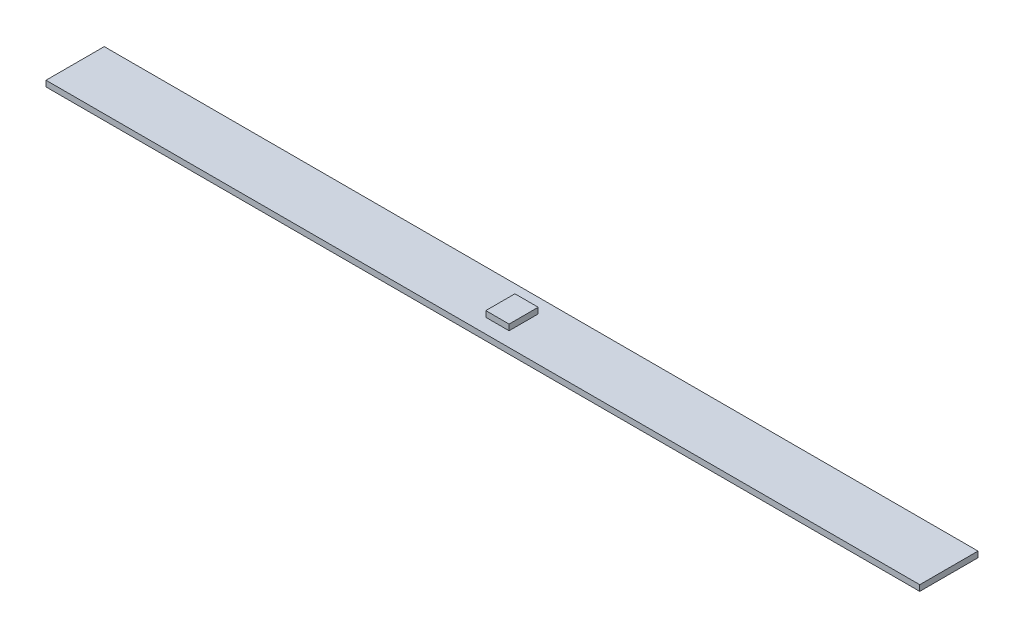
ISO-10303-21;
HEADER;
FILE_DESCRIPTION(('STEP AP214'),'2;1');
FILE_NAME('part.step','',(''),(''),'','','');
FILE_SCHEMA(('AUTOMOTIVE_DESIGN { 1 0 10303 214 1 1 1 1 }'));
ENDSEC;
DATA;
#1=APPLICATION_CONTEXT('core data for automotive mechanical design processes');
#2=APPLICATION_PROTOCOL_DEFINITION('international standard','automotive_design',2000,#1);
#3=PRODUCT_CONTEXT('',#1,'mechanical');
#4=PRODUCT('Part','Part','',(#3));
#5=PRODUCT_RELATED_PRODUCT_CATEGORY('part','',(#4));
#6=PRODUCT_DEFINITION_FORMATION('','',#4);
#7=PRODUCT_DEFINITION_CONTEXT('part definition',#1,'design');
#8=PRODUCT_DEFINITION('design','',#6,#7);
#9=PRODUCT_DEFINITION_SHAPE('','',#8);
#10=(LENGTH_UNIT() NAMED_UNIT(*) SI_UNIT(.MILLI.,.METRE.));
#11=(NAMED_UNIT(*) PLANE_ANGLE_UNIT() SI_UNIT($,.RADIAN.));
#12=(NAMED_UNIT(*) SI_UNIT($,.STERADIAN.) SOLID_ANGLE_UNIT());
#13=UNCERTAINTY_MEASURE_WITH_UNIT(LENGTH_MEASURE(1.E-05),#10,'distance_accuracy_value','');
#14=(GEOMETRIC_REPRESENTATION_CONTEXT(3) GLOBAL_UNCERTAINTY_ASSIGNED_CONTEXT((#13)) GLOBAL_UNIT_ASSIGNED_CONTEXT((#10,
#11,#12)) REPRESENTATION_CONTEXT('',''));
#15=CARTESIAN_POINT('',(0.,0.,0.));
#16=DIRECTION('',(0.,0.,1.));
#17=DIRECTION('',(1.,0.,0.));
#18=AXIS2_PLACEMENT_3D('',#15,#16,#17);
#19=CARTESIAN_POINT('',(0.,1.,0.));
#20=DIRECTION('',(0.,1.,0.));
#21=DIRECTION('',(0.,0.,1.));
#22=AXIS2_PLACEMENT_3D('',#19,#20,#21);
#23=PLANE('',#22);
#24=DIRECTION('',(0.,0.,-1.));
#25=VECTOR('',#24,1.);
#26=CARTESIAN_POINT('',(75.,1.,-5.));
#27=LINE('',#26,#25);
#28=CARTESIAN_POINT('',(75.,1.,5.));
#29=VERTEX_POINT('',#28);
#30=CARTESIAN_POINT('',(75.,1.,-5.));
#31=VERTEX_POINT('',#30);
#32=EDGE_CURVE('E154',#29,#31,#27,.T.);
#33=ORIENTED_EDGE('',*,*,#32,.T.);
#34=DIRECTION('',(-1.,0.,0.));
#35=VECTOR('',#34,1.);
#36=CARTESIAN_POINT('',(-75.,1.,-5.));
#37=LINE('',#36,#35);
#38=CARTESIAN_POINT('',(-75.,1.,-5.));
#39=VERTEX_POINT('',#38);
#40=EDGE_CURVE('E94',#31,#39,#37,.T.);
#41=ORIENTED_EDGE('',*,*,#40,.T.);
#42=DIRECTION('',(0.,0.,1.));
#43=VECTOR('',#42,1.);
#44=CARTESIAN_POINT('',(-75.,1.,-5.));
#45=LINE('',#44,#43);
#46=CARTESIAN_POINT('',(-75.,1.,5.));
#47=VERTEX_POINT('',#46);
#48=EDGE_CURVE('E159',#39,#47,#45,.T.);
#49=ORIENTED_EDGE('',*,*,#48,.T.);
#50=DIRECTION('',(1.,0.,0.));
#51=VECTOR('',#50,1.);
#52=CARTESIAN_POINT('',(-75.,1.,5.));
#53=LINE('',#52,#51);
#54=EDGE_CURVE('E66',#47,#29,#53,.T.);
#55=ORIENTED_EDGE('',*,*,#54,.T.);
#56=EDGE_LOOP('',(#33,#41,#49,#55));
#57=FACE_BOUND('',#56,.T.);
#58=DIRECTION('',(-1.,0.,0.));
#59=VECTOR('',#58,1.);
#60=CARTESIAN_POINT('',(-2.,1.,-2.5));
#61=LINE('',#60,#59);
#62=CARTESIAN_POINT('',(2.,1.,-2.5));
#63=VERTEX_POINT('',#62);
#64=CARTESIAN_POINT('',(-2.,1.,-2.5));
#65=VERTEX_POINT('',#64);
#66=EDGE_CURVE('E291',#63,#65,#61,.T.);
#67=ORIENTED_EDGE('',*,*,#66,.F.);
#68=DIRECTION('',(0.,0.,-1.));
#69=VECTOR('',#68,1.);
#70=CARTESIAN_POINT('',(2.,1.,-2.5));
#71=LINE('',#70,#69);
#72=CARTESIAN_POINT('',(2.,1.,2.5));
#73=VERTEX_POINT('',#72);
#74=EDGE_CURVE('E141',#73,#63,#71,.T.);
#75=ORIENTED_EDGE('',*,*,#74,.F.);
#76=DIRECTION('',(1.,0.,0.));
#77=VECTOR('',#76,1.);
#78=CARTESIAN_POINT('',(-2.,1.,2.5));
#79=LINE('',#78,#77);
#80=CARTESIAN_POINT('',(-2.,1.,2.5));
#81=VERTEX_POINT('',#80);
#82=EDGE_CURVE('E137',#81,#73,#79,.T.);
#83=ORIENTED_EDGE('',*,*,#82,.F.);
#84=DIRECTION('',(0.,0.,1.));
#85=VECTOR('',#84,1.);
#86=CARTESIAN_POINT('',(-2.,1.,-2.5));
#87=LINE('',#86,#85);
#88=EDGE_CURVE('E287',#65,#81,#87,.T.);
#89=ORIENTED_EDGE('',*,*,#88,.F.);
#90=EDGE_LOOP('',(#67,#75,#83,#89));
#91=FACE_BOUND('',#90,.T.);
#92=ADVANCED_FACE('F41',(#57,#91),#23,.T.);
#93=CARTESIAN_POINT('',(75.,1.,-5.));
#94=DIRECTION('',(-1.,0.,0.));
#95=DIRECTION('',(0.,0.,1.));
#96=AXIS2_PLACEMENT_3D('',#93,#94,#95);
#97=PLANE('',#96);
#98=DIRECTION('',(0.,0.,-1.));
#99=VECTOR('',#98,1.);
#100=CARTESIAN_POINT('',(75.,0.,-5.));
#101=LINE('',#100,#99);
#102=CARTESIAN_POINT('',(75.,0.,5.));
#103=VERTEX_POINT('',#102);
#104=CARTESIAN_POINT('',(75.,0.,-5.));
#105=VERTEX_POINT('',#104);
#106=EDGE_CURVE('E144',#103,#105,#101,.T.);
#107=ORIENTED_EDGE('',*,*,#106,.T.);
#108=DIRECTION('',(0.,-1.,0.));
#109=VECTOR('',#108,1.);
#110=CARTESIAN_POINT('',(75.,1.,-5.));
#111=LINE('',#110,#109);
#112=EDGE_CURVE('E11',#31,#105,#111,.T.);
#113=ORIENTED_EDGE('',*,*,#112,.F.);
#114=ORIENTED_EDGE('',*,*,#32,.F.);
#115=DIRECTION('',(0.,-1.,0.));
#116=VECTOR('',#115,1.);
#117=CARTESIAN_POINT('',(75.,1.,5.));
#118=LINE('',#117,#116);
#119=EDGE_CURVE('E163',#29,#103,#118,.T.);
#120=ORIENTED_EDGE('',*,*,#119,.T.);
#121=EDGE_LOOP('',(#107,#113,#114,#120));
#122=FACE_BOUND('',#121,.T.);
#123=ADVANCED_FACE('F43',(#122),#97,.F.);
#124=CARTESIAN_POINT('',(-75.,1.,-5.));
#125=DIRECTION('',(0.,0.,1.));
#126=DIRECTION('',(1.,0.,0.));
#127=AXIS2_PLACEMENT_3D('',#124,#125,#126);
#128=PLANE('',#127);
#129=DIRECTION('',(-1.,0.,0.));
#130=VECTOR('',#129,1.);
#131=CARTESIAN_POINT('',(-75.,0.,-5.));
#132=LINE('',#131,#130);
#133=CARTESIAN_POINT('',(-75.,0.,-5.));
#134=VERTEX_POINT('',#133);
#135=EDGE_CURVE('E149',#105,#134,#132,.T.);
#136=ORIENTED_EDGE('',*,*,#135,.T.);
#137=DIRECTION('',(0.,-1.,0.));
#138=VECTOR('',#137,1.);
#139=CARTESIAN_POINT('',(-75.,1.,-5.));
#140=LINE('',#139,#138);
#141=EDGE_CURVE('E50',#39,#134,#140,.T.);
#142=ORIENTED_EDGE('',*,*,#141,.F.);
#143=ORIENTED_EDGE('',*,*,#40,.F.);
#144=ORIENTED_EDGE('',*,*,#112,.T.);
#145=EDGE_LOOP('',(#136,#142,#143,#144));
#146=FACE_BOUND('',#145,.T.);
#147=ADVANCED_FACE('F197',(#146),#128,.F.);
#148=CARTESIAN_POINT('',(-75.,1.,-5.));
#149=DIRECTION('',(1.,0.,0.));
#150=DIRECTION('',(0.,0.,-1.));
#151=AXIS2_PLACEMENT_3D('',#148,#149,#150);
#152=PLANE('',#151);
#153=DIRECTION('',(0.,0.,1.));
#154=VECTOR('',#153,1.);
#155=CARTESIAN_POINT('',(-75.,0.,-5.));
#156=LINE('',#155,#154);
#157=CARTESIAN_POINT('',(-75.,0.,5.));
#158=VERTEX_POINT('',#157);
#159=EDGE_CURVE('E167',#134,#158,#156,.T.);
#160=ORIENTED_EDGE('',*,*,#159,.T.);
#161=DIRECTION('',(0.,-1.,0.));
#162=VECTOR('',#161,1.);
#163=CARTESIAN_POINT('',(-75.,1.,5.));
#164=LINE('',#163,#162);
#165=EDGE_CURVE('E174',#47,#158,#164,.T.);
#166=ORIENTED_EDGE('',*,*,#165,.F.);
#167=ORIENTED_EDGE('',*,*,#48,.F.);
#168=ORIENTED_EDGE('',*,*,#141,.T.);
#169=EDGE_LOOP('',(#160,#166,#167,#168));
#170=FACE_BOUND('',#169,.T.);
#171=ADVANCED_FACE('F181',(#170),#152,.F.);
#172=CARTESIAN_POINT('',(-75.,1.,5.));
#173=DIRECTION('',(0.,0.,-1.));
#174=DIRECTION('',(-1.,0.,0.));
#175=AXIS2_PLACEMENT_3D('',#172,#173,#174);
#176=PLANE('',#175);
#177=DIRECTION('',(1.,0.,0.));
#178=VECTOR('',#177,1.);
#179=CARTESIAN_POINT('',(-75.,0.,5.));
#180=LINE('',#179,#178);
#181=EDGE_CURVE('E87',#158,#103,#180,.T.);
#182=ORIENTED_EDGE('',*,*,#181,.T.);
#183=ORIENTED_EDGE('',*,*,#119,.F.);
#184=ORIENTED_EDGE('',*,*,#54,.F.);
#185=ORIENTED_EDGE('',*,*,#165,.T.);
#186=EDGE_LOOP('',(#182,#183,#184,#185));
#187=FACE_BOUND('',#186,.T.);
#188=ADVANCED_FACE('F189',(#187),#176,.F.);
#189=CARTESIAN_POINT('',(0.,0.,0.));
#190=DIRECTION('',(0.,1.,0.));
#191=DIRECTION('',(0.,0.,1.));
#192=AXIS2_PLACEMENT_3D('',#189,#190,#191);
#193=PLANE('',#192);
#194=ORIENTED_EDGE('',*,*,#106,.F.);
#195=ORIENTED_EDGE('',*,*,#181,.F.);
#196=ORIENTED_EDGE('',*,*,#159,.F.);
#197=ORIENTED_EDGE('',*,*,#135,.F.);
#198=EDGE_LOOP('',(#194,#195,#196,#197));
#199=FACE_BOUND('',#198,.T.);
#200=ADVANCED_FACE('F185',(#199),#193,.F.);
#201=CARTESIAN_POINT('',(2.,2.,-2.5));
#202=DIRECTION('',(-1.,0.,0.));
#203=DIRECTION('',(0.,0.,1.));
#204=AXIS2_PLACEMENT_3D('',#201,#202,#203);
#205=PLANE('',#204);
#206=ORIENTED_EDGE('',*,*,#74,.T.);
#207=DIRECTION('',(0.,-1.,0.));
#208=VECTOR('',#207,1.);
#209=CARTESIAN_POINT('',(2.,2.,-2.5));
#210=LINE('',#209,#208);
#211=CARTESIAN_POINT('',(2.,2.,-2.5));
#212=VERTEX_POINT('',#211);
#213=EDGE_CURVE('E120',#212,#63,#210,.T.);
#214=ORIENTED_EDGE('',*,*,#213,.F.);
#215=DIRECTION('',(0.,0.,-1.));
#216=VECTOR('',#215,1.);
#217=CARTESIAN_POINT('',(2.,2.,-2.5));
#218=LINE('',#217,#216);
#219=CARTESIAN_POINT('',(2.,2.,2.5));
#220=VERTEX_POINT('',#219);
#221=EDGE_CURVE('E128',#220,#212,#218,.T.);
#222=ORIENTED_EDGE('',*,*,#221,.F.);
#223=DIRECTION('',(0.,-1.,0.));
#224=VECTOR('',#223,1.);
#225=CARTESIAN_POINT('',(2.,2.,2.5));
#226=LINE('',#225,#224);
#227=EDGE_CURVE('E284',#220,#73,#226,.T.);
#228=ORIENTED_EDGE('',*,*,#227,.T.);
#229=EDGE_LOOP('',(#206,#214,#222,#228));
#230=FACE_BOUND('',#229,.T.);
#231=ADVANCED_FACE('F139',(#230),#205,.F.);
#232=CARTESIAN_POINT('',(-2.,2.,-2.5));
#233=DIRECTION('',(0.,0.,1.));
#234=DIRECTION('',(1.,0.,0.));
#235=AXIS2_PLACEMENT_3D('',#232,#233,#234);
#236=PLANE('',#235);
#237=ORIENTED_EDGE('',*,*,#66,.T.);
#238=DIRECTION('',(0.,-1.,0.));
#239=VECTOR('',#238,1.);
#240=CARTESIAN_POINT('',(-2.,2.,-2.5));
#241=LINE('',#240,#239);
#242=CARTESIAN_POINT('',(-2.,2.,-2.5));
#243=VERTEX_POINT('',#242);
#244=EDGE_CURVE('E123',#243,#65,#241,.T.);
#245=ORIENTED_EDGE('',*,*,#244,.F.);
#246=DIRECTION('',(-1.,0.,0.));
#247=VECTOR('',#246,1.);
#248=CARTESIAN_POINT('',(-2.,2.,-2.5));
#249=LINE('',#248,#247);
#250=EDGE_CURVE('E116',#212,#243,#249,.T.);
#251=ORIENTED_EDGE('',*,*,#250,.F.);
#252=ORIENTED_EDGE('',*,*,#213,.T.);
#253=EDGE_LOOP('',(#237,#245,#251,#252));
#254=FACE_BOUND('',#253,.T.);
#255=ADVANCED_FACE('F118',(#254),#236,.F.);
#256=CARTESIAN_POINT('',(-2.,2.,-2.5));
#257=DIRECTION('',(1.,0.,0.));
#258=DIRECTION('',(0.,0.,-1.));
#259=AXIS2_PLACEMENT_3D('',#256,#257,#258);
#260=PLANE('',#259);
#261=ORIENTED_EDGE('',*,*,#88,.T.);
#262=DIRECTION('',(0.,-1.,0.));
#263=VECTOR('',#262,1.);
#264=CARTESIAN_POINT('',(-2.,2.,2.5));
#265=LINE('',#264,#263);
#266=CARTESIAN_POINT('',(-2.,2.,2.5));
#267=VERTEX_POINT('',#266);
#268=EDGE_CURVE('E57',#267,#81,#265,.T.);
#269=ORIENTED_EDGE('',*,*,#268,.F.);
#270=DIRECTION('',(0.,0.,1.));
#271=VECTOR('',#270,1.);
#272=CARTESIAN_POINT('',(-2.,2.,-2.5));
#273=LINE('',#272,#271);
#274=EDGE_CURVE('E127',#243,#267,#273,.T.);
#275=ORIENTED_EDGE('',*,*,#274,.F.);
#276=ORIENTED_EDGE('',*,*,#244,.T.);
#277=EDGE_LOOP('',(#261,#269,#275,#276));
#278=FACE_BOUND('',#277,.T.);
#279=ADVANCED_FACE('F210',(#278),#260,.F.);
#280=CARTESIAN_POINT('',(-2.,2.,2.5));
#281=DIRECTION('',(0.,0.,-1.));
#282=DIRECTION('',(-1.,0.,0.));
#283=AXIS2_PLACEMENT_3D('',#280,#281,#282);
#284=PLANE('',#283);
#285=ORIENTED_EDGE('',*,*,#82,.T.);
#286=ORIENTED_EDGE('',*,*,#227,.F.);
#287=DIRECTION('',(1.,0.,0.));
#288=VECTOR('',#287,1.);
#289=CARTESIAN_POINT('',(-2.,2.,2.5));
#290=LINE('',#289,#288);
#291=EDGE_CURVE('E132',#267,#220,#290,.T.);
#292=ORIENTED_EDGE('',*,*,#291,.F.);
#293=ORIENTED_EDGE('',*,*,#268,.T.);
#294=EDGE_LOOP('',(#285,#286,#292,#293));
#295=FACE_BOUND('',#294,.T.);
#296=ADVANCED_FACE('F213',(#295),#284,.F.);
#297=CARTESIAN_POINT('',(0.,2.,0.));
#298=DIRECTION('',(0.,1.,0.));
#299=DIRECTION('',(0.,0.,1.));
#300=AXIS2_PLACEMENT_3D('',#297,#298,#299);
#301=PLANE('',#300);
#302=ORIENTED_EDGE('',*,*,#221,.T.);
#303=ORIENTED_EDGE('',*,*,#250,.T.);
#304=ORIENTED_EDGE('',*,*,#274,.T.);
#305=ORIENTED_EDGE('',*,*,#291,.T.);
#306=EDGE_LOOP('',(#302,#303,#304,#305));
#307=FACE_BOUND('',#306,.T.);
#308=ADVANCED_FACE('F131',(#307),#301,.T.);
#309=CLOSED_SHELL('',(#92,#123,#147,#171,#188,#200,#231,#255,#279,#296,#308));
#310=MANIFOLD_SOLID_BREP('B2',#309);
#311=ADVANCED_BREP_SHAPE_REPRESENTATION('',(#18,#310),#14);
#312=SHAPE_DEFINITION_REPRESENTATION(#9,#311);
ENDSEC;
END-ISO-10303-21;
